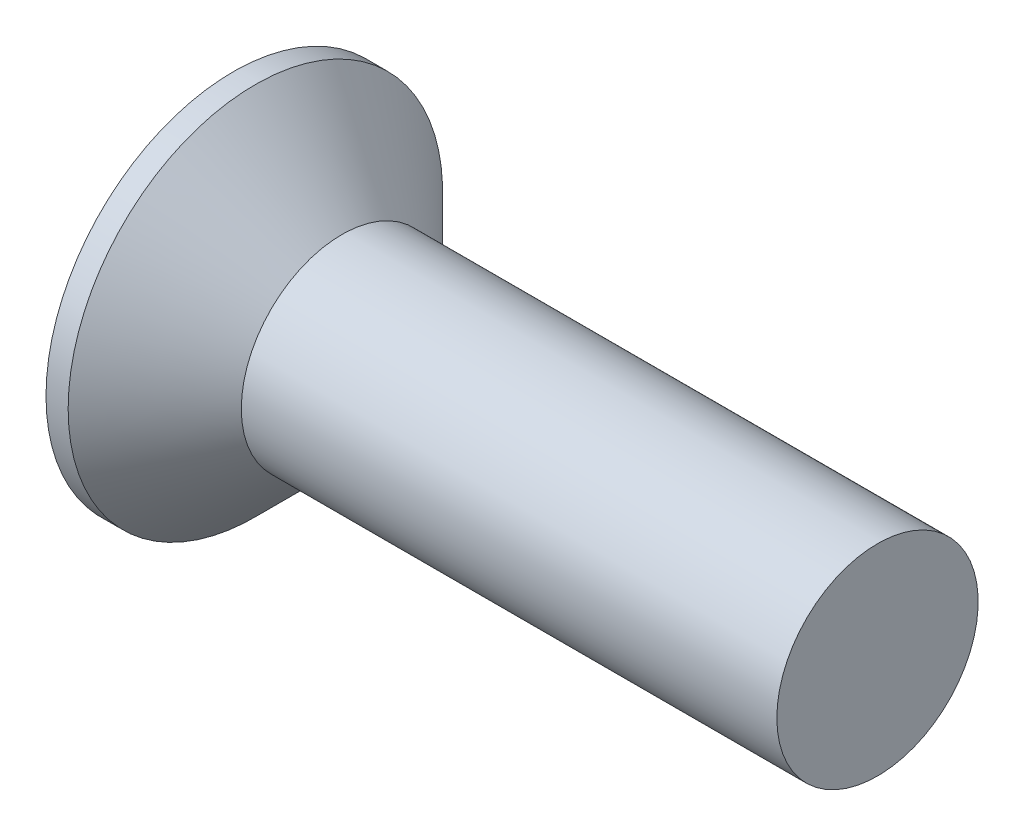
ISO-10303-21;
HEADER;
FILE_DESCRIPTION(('STEP AP214'),'2;1');
FILE_NAME('part.step','',(''),(''),'','','');
FILE_SCHEMA(('AUTOMOTIVE_DESIGN { 1 0 10303 214 1 1 1 1 }'));
ENDSEC;
DATA;
#1=APPLICATION_CONTEXT('core data for automotive mechanical design processes');
#2=APPLICATION_PROTOCOL_DEFINITION('international standard','automotive_design',2000,#1);
#3=PRODUCT_CONTEXT('',#1,'mechanical');
#4=PRODUCT('Part','Part','',(#3));
#5=PRODUCT_RELATED_PRODUCT_CATEGORY('part','',(#4));
#6=PRODUCT_DEFINITION_FORMATION('','',#4);
#7=PRODUCT_DEFINITION_CONTEXT('part definition',#1,'design');
#8=PRODUCT_DEFINITION('design','',#6,#7);
#9=PRODUCT_DEFINITION_SHAPE('','',#8);
#10=(LENGTH_UNIT() NAMED_UNIT(*) SI_UNIT(.MILLI.,.METRE.));
#11=(NAMED_UNIT(*) PLANE_ANGLE_UNIT() SI_UNIT($,.RADIAN.));
#12=(NAMED_UNIT(*) SI_UNIT($,.STERADIAN.) SOLID_ANGLE_UNIT());
#13=UNCERTAINTY_MEASURE_WITH_UNIT(LENGTH_MEASURE(1.E-05),#10,'distance_accuracy_value','');
#14=(GEOMETRIC_REPRESENTATION_CONTEXT(3) GLOBAL_UNCERTAINTY_ASSIGNED_CONTEXT((#13)) GLOBAL_UNIT_ASSIGNED_CONTEXT((#10,
#11,#12)) REPRESENTATION_CONTEXT('',''));
#15=CARTESIAN_POINT('',(0.,0.,0.));
#16=DIRECTION('',(0.,0.,1.));
#17=DIRECTION('',(1.,0.,0.));
#18=AXIS2_PLACEMENT_3D('',#15,#16,#17);
#19=CARTESIAN_POINT('',(0.,4.65,0.));
#20=DIRECTION('',(1.,0.,0.));
#21=DIRECTION('',(0.,0.,-1.));
#22=AXIS2_PLACEMENT_3D('',#19,#20,#21);
#23=PLANE('',#22);
#24=CARTESIAN_POINT('',(0.,0.,0.));
#25=DIRECTION('',(-1.,0.,0.));
#26=DIRECTION('',(0.,0.,1.));
#27=AXIS2_PLACEMENT_3D('',#24,#25,#26);
#28=CIRCLE('',#27,4.65);
#29=CARTESIAN_POINT('',(0.,0.,4.65));
#30=VERTEX_POINT('',#29);
#31=EDGE_CURVE('E44',#30,#30,#28,.T.);
#32=ORIENTED_EDGE('',*,*,#31,.T.);
#33=EDGE_LOOP('',(#32));
#34=FACE_BOUND('',#33,.T.);
#35=ADVANCED_FACE('F30',(#34),#23,.F.);
#36=CARTESIAN_POINT('',(16.,0.,0.));
#37=DIRECTION('',(-1.,0.,0.));
#38=DIRECTION('',(0.,0.,1.));
#39=AXIS2_PLACEMENT_3D('',#36,#37,#38);
#40=PLANE('',#39);
#41=CARTESIAN_POINT('',(16.,0.,0.));
#42=DIRECTION('',(-1.,0.,0.));
#43=DIRECTION('',(0.,0.,1.));
#44=AXIS2_PLACEMENT_3D('',#41,#42,#43);
#45=CIRCLE('',#44,2.5);
#46=CARTESIAN_POINT('',(16.,0.,2.5));
#47=VERTEX_POINT('',#46);
#48=EDGE_CURVE('E10',#47,#47,#45,.T.);
#49=ORIENTED_EDGE('',*,*,#48,.F.);
#50=EDGE_LOOP('',(#49));
#51=FACE_BOUND('',#50,.T.);
#52=ADVANCED_FACE('F64',(#51),#40,.F.);
#53=CARTESIAN_POINT('',(0.,0.,0.));
#54=DIRECTION('',(-1.,0.,0.));
#55=DIRECTION('',(0.,0.,1.));
#56=AXIS2_PLACEMENT_3D('',#53,#54,#55);
#57=CYLINDRICAL_SURFACE('',#56,2.5);
#58=CARTESIAN_POINT('',(2.7,0.,0.));
#59=DIRECTION('',(-1.,0.,0.));
#60=DIRECTION('',(0.,0.,1.));
#61=AXIS2_PLACEMENT_3D('',#58,#59,#60);
#62=CIRCLE('',#61,2.5);
#63=CARTESIAN_POINT('',(2.7,0.,2.5));
#64=VERTEX_POINT('',#63);
#65=EDGE_CURVE('E36',#64,#64,#62,.T.);
#66=ORIENTED_EDGE('',*,*,#65,.F.);
#67=EDGE_LOOP('',(#66));
#68=FACE_BOUND('',#67,.T.);
#69=ORIENTED_EDGE('',*,*,#48,.T.);
#70=EDGE_LOOP('',(#69));
#71=FACE_BOUND('',#70,.T.);
#72=ADVANCED_FACE('F59',(#68,#71),#57,.T.);
#73=CARTESIAN_POINT('',(2.7,0.,0.));
#74=DIRECTION('',(-1.,0.,0.));
#75=DIRECTION('',(0.,0.,1.));
#76=AXIS2_PLACEMENT_3D('',#73,#74,#75);
#77=CONICAL_SURFACE('',#76,2.5,0.78539816339745);
#78=CARTESIAN_POINT('',(0.550000000000006,0.,0.));
#79=DIRECTION('',(-1.,0.,0.));
#80=DIRECTION('',(0.,0.,1.));
#81=AXIS2_PLACEMENT_3D('',#78,#79,#80);
#82=CIRCLE('',#81,4.65);
#83=CARTESIAN_POINT('',(0.550000000000006,0.,4.65));
#84=VERTEX_POINT('',#83);
#85=EDGE_CURVE('E40',#84,#84,#82,.T.);
#86=ORIENTED_EDGE('',*,*,#85,.F.);
#87=EDGE_LOOP('',(#86));
#88=FACE_BOUND('',#87,.T.);
#89=ORIENTED_EDGE('',*,*,#65,.T.);
#90=EDGE_LOOP('',(#89));
#91=FACE_BOUND('',#90,.T.);
#92=ADVANCED_FACE('F54',(#88,#91),#77,.T.);
#93=CARTESIAN_POINT('',(0.,0.,0.));
#94=DIRECTION('',(-1.,0.,0.));
#95=DIRECTION('',(0.,0.,1.));
#96=AXIS2_PLACEMENT_3D('',#93,#94,#95);
#97=CYLINDRICAL_SURFACE('',#96,4.65);
#98=ORIENTED_EDGE('',*,*,#31,.F.);
#99=EDGE_LOOP('',(#98));
#100=FACE_BOUND('',#99,.T.);
#101=ORIENTED_EDGE('',*,*,#85,.T.);
#102=EDGE_LOOP('',(#101));
#103=FACE_BOUND('',#102,.T.);
#104=ADVANCED_FACE('F51',(#100,#103),#97,.T.);
#105=CLOSED_SHELL('',(#35,#52,#72,#92,#104));
#106=MANIFOLD_SOLID_BREP('B2',#105);
#107=ADVANCED_BREP_SHAPE_REPRESENTATION('',(#18,#106),#14);
#108=SHAPE_DEFINITION_REPRESENTATION(#9,#107);
ENDSEC;
END-ISO-10303-21;
